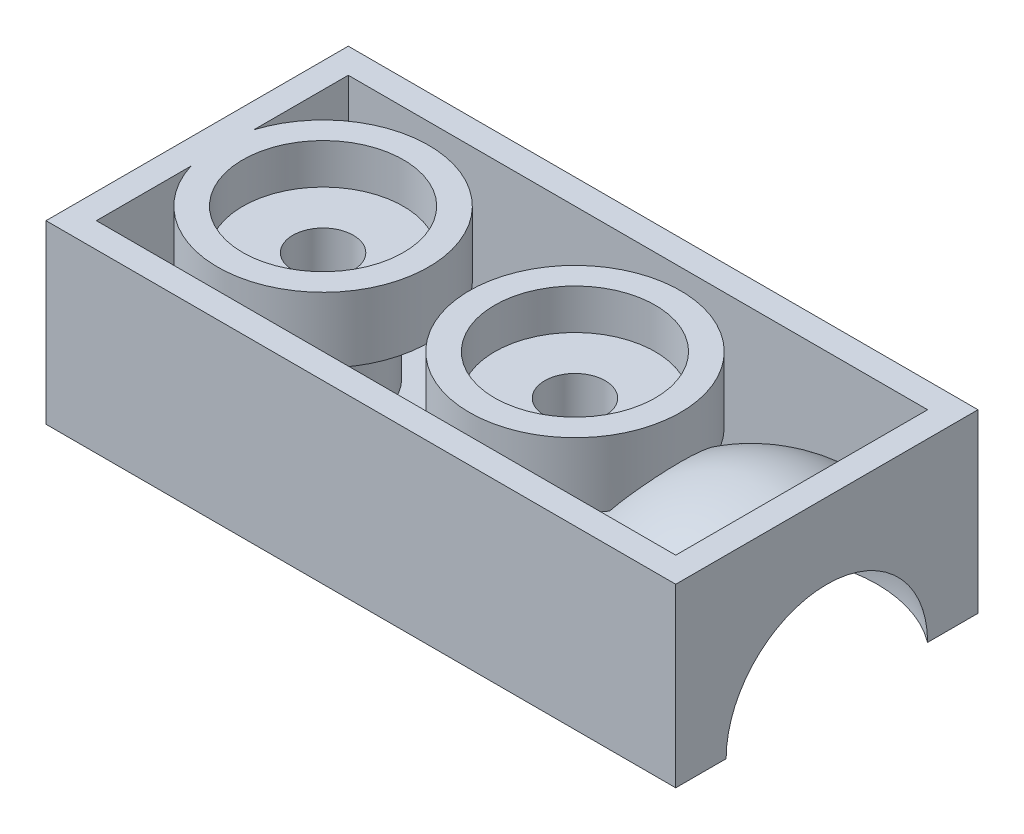
ISO-10303-21;
HEADER;
FILE_DESCRIPTION(('STEP AP214'),'2;1');
FILE_NAME('part.step','',(''),(''),'','','');
FILE_SCHEMA(('AUTOMOTIVE_DESIGN { 1 0 10303 214 1 1 1 1 }'));
ENDSEC;
DATA;
#1=APPLICATION_CONTEXT('core data for automotive mechanical design processes');
#2=APPLICATION_PROTOCOL_DEFINITION('international standard','automotive_design',2000,#1);
#3=PRODUCT_CONTEXT('',#1,'mechanical');
#4=PRODUCT('Part','Part','',(#3));
#5=PRODUCT_RELATED_PRODUCT_CATEGORY('part','',(#4));
#6=PRODUCT_DEFINITION_FORMATION('','',#4);
#7=PRODUCT_DEFINITION_CONTEXT('part definition',#1,'design');
#8=PRODUCT_DEFINITION('design','',#6,#7);
#9=PRODUCT_DEFINITION_SHAPE('','',#8);
#10=(LENGTH_UNIT() NAMED_UNIT(*) SI_UNIT(.MILLI.,.METRE.));
#11=(NAMED_UNIT(*) PLANE_ANGLE_UNIT() SI_UNIT($,.RADIAN.));
#12=(NAMED_UNIT(*) SI_UNIT($,.STERADIAN.) SOLID_ANGLE_UNIT());
#13=UNCERTAINTY_MEASURE_WITH_UNIT(LENGTH_MEASURE(1.E-05),#10,'distance_accuracy_value','');
#14=(GEOMETRIC_REPRESENTATION_CONTEXT(3) GLOBAL_UNCERTAINTY_ASSIGNED_CONTEXT((#13)) GLOBAL_UNIT_ASSIGNED_CONTEXT((#10,
#11,#12)) REPRESENTATION_CONTEXT('',''));
#15=CARTESIAN_POINT('',(0.,0.,0.));
#16=DIRECTION('',(0.,0.,1.));
#17=DIRECTION('',(1.,0.,0.));
#18=AXIS2_PLACEMENT_3D('',#15,#16,#17);
#19=CARTESIAN_POINT('',(0.,7.,0.));
#20=DIRECTION('',(0.,1.,0.));
#21=DIRECTION('',(0.,0.,1.));
#22=AXIS2_PLACEMENT_3D('',#19,#20,#21);
#23=PLANE('',#22);
#24=CARTESIAN_POINT('',(2.5,7.,0.));
#25=DIRECTION('',(0.,1.,0.));
#26=DIRECTION('',(0.,0.,1.));
#27=AXIS2_PLACEMENT_3D('',#24,#25,#26);
#28=CIRCLE('',#27,3.19);
#29=CARTESIAN_POINT('',(2.5,7.,3.19));
#30=VERTEX_POINT('',#29);
#31=EDGE_CURVE('E375',#30,#30,#28,.T.);
#32=ORIENTED_EDGE('',*,*,#31,.F.);
#33=EDGE_LOOP('',(#32));
#34=FACE_BOUND('',#33,.T.);
#35=CARTESIAN_POINT('',(2.5,7.,0.));
#36=DIRECTION('',(0.,1.,0.));
#37=DIRECTION('',(0.,0.,1.));
#38=AXIS2_PLACEMENT_3D('',#35,#36,#37);
#39=CIRCLE('',#38,4.19);
#40=CARTESIAN_POINT('',(2.5,7.,4.19));
#41=VERTEX_POINT('',#40);
#42=EDGE_CURVE('E179',#41,#41,#39,.T.);
#43=ORIENTED_EDGE('',*,*,#42,.T.);
#44=EDGE_LOOP('',(#43));
#45=FACE_BOUND('',#44,.T.);
#46=ADVANCED_FACE('F33',(#34,#45),#23,.T.);
#47=CARTESIAN_POINT('',(2.5,7.,0.));
#48=DIRECTION('',(0.,1.,0.));
#49=DIRECTION('',(0.,0.,1.));
#50=AXIS2_PLACEMENT_3D('',#47,#48,#49);
#51=CYLINDRICAL_SURFACE('',#50,1.2);
#52=CARTESIAN_POINT('',(2.5,5.4,0.));
#53=DIRECTION('',(0.,1.,0.));
#54=DIRECTION('',(0.,0.,1.));
#55=AXIS2_PLACEMENT_3D('',#52,#53,#54);
#56=CIRCLE('',#55,1.2);
#57=CARTESIAN_POINT('',(2.5,5.4,1.2));
#58=VERTEX_POINT('',#57);
#59=EDGE_CURVE('E365',#58,#58,#56,.T.);
#60=ORIENTED_EDGE('',*,*,#59,.T.);
#61=EDGE_LOOP('',(#60));
#62=FACE_BOUND('',#61,.T.);
#63=CARTESIAN_POINT('',(2.5,1.,0.));
#64=DIRECTION('',(0.,-1.,0.));
#65=DIRECTION('',(0.,0.,-1.));
#66=AXIS2_PLACEMENT_3D('',#63,#64,#65);
#67=CIRCLE('',#66,1.2);
#68=CARTESIAN_POINT('',(2.5,1.,-1.2));
#69=VERTEX_POINT('',#68);
#70=EDGE_CURVE('E255',#69,#69,#67,.T.);
#71=ORIENTED_EDGE('',*,*,#70,.T.);
#72=EDGE_LOOP('',(#71));
#73=FACE_BOUND('',#72,.T.);
#74=ADVANCED_FACE('F297',(#62,#73),#51,.F.);
#75=CARTESIAN_POINT('',(-12.5,7.,-6.));
#76=DIRECTION('',(1.,0.,0.));
#77=DIRECTION('',(0.,0.,-1.));
#78=AXIS2_PLACEMENT_3D('',#75,#76,#77);
#79=PLANE('',#78);
#80=DIRECTION('',(0.,0.,1.));
#81=VECTOR('',#80,1.);
#82=CARTESIAN_POINT('',(-12.5,0.,-6.));
#83=LINE('',#82,#81);
#84=CARTESIAN_POINT('',(-12.5,0.,-6.));
#85=VERTEX_POINT('',#84);
#86=CARTESIAN_POINT('',(-12.5,0.,6.));
#87=VERTEX_POINT('',#86);
#88=EDGE_CURVE('E346',#85,#87,#83,.T.);
#89=ORIENTED_EDGE('',*,*,#88,.T.);
#90=DIRECTION('',(0.,-1.,0.));
#91=VECTOR('',#90,1.);
#92=CARTESIAN_POINT('',(-12.5,7.,6.));
#93=LINE('',#92,#91);
#94=CARTESIAN_POINT('',(-12.5,7.,6.));
#95=VERTEX_POINT('',#94);
#96=EDGE_CURVE('E41',#95,#87,#93,.T.);
#97=ORIENTED_EDGE('',*,*,#96,.F.);
#98=DIRECTION('',(0.,0.,1.));
#99=VECTOR('',#98,1.);
#100=CARTESIAN_POINT('',(-12.5,7.,-6.));
#101=LINE('',#100,#99);
#102=CARTESIAN_POINT('',(-12.5,7.,-6.));
#103=VERTEX_POINT('',#102);
#104=EDGE_CURVE('E332',#103,#95,#101,.T.);
#105=ORIENTED_EDGE('',*,*,#104,.F.);
#106=DIRECTION('',(0.,-1.,0.));
#107=VECTOR('',#106,1.);
#108=CARTESIAN_POINT('',(-12.5,7.,-6.));
#109=LINE('',#108,#107);
#110=EDGE_CURVE('E355',#103,#85,#109,.T.);
#111=ORIENTED_EDGE('',*,*,#110,.T.);
#112=EDGE_LOOP('',(#89,#97,#105,#111));
#113=FACE_BOUND('',#112,.T.);
#114=ADVANCED_FACE('F35',(#113),#79,.F.);
#115=CARTESIAN_POINT('',(-12.5,7.,6.));
#116=DIRECTION('',(0.,0.,-1.));
#117=DIRECTION('',(-1.,0.,0.));
#118=AXIS2_PLACEMENT_3D('',#115,#116,#117);
#119=PLANE('',#118);
#120=DIRECTION('',(1.,0.,0.));
#121=VECTOR('',#120,1.);
#122=CARTESIAN_POINT('',(-12.5,0.,6.));
#123=LINE('',#122,#121);
#124=CARTESIAN_POINT('',(12.5,0.,6.));
#125=VERTEX_POINT('',#124);
#126=EDGE_CURVE('E362',#87,#125,#123,.T.);
#127=ORIENTED_EDGE('',*,*,#126,.T.);
#128=DIRECTION('',(0.,-1.,0.));
#129=VECTOR('',#128,1.);
#130=CARTESIAN_POINT('',(12.5,7.,6.));
#131=LINE('',#130,#129);
#132=CARTESIAN_POINT('',(12.5,7.,6.));
#133=VERTEX_POINT('',#132);
#134=EDGE_CURVE('E348',#133,#125,#131,.T.);
#135=ORIENTED_EDGE('',*,*,#134,.F.);
#136=DIRECTION('',(1.,0.,0.));
#137=VECTOR('',#136,1.);
#138=CARTESIAN_POINT('',(-12.5,7.,6.));
#139=LINE('',#138,#137);
#140=EDGE_CURVE('E334',#95,#133,#139,.T.);
#141=ORIENTED_EDGE('',*,*,#140,.F.);
#142=ORIENTED_EDGE('',*,*,#96,.T.);
#143=EDGE_LOOP('',(#127,#135,#141,#142));
#144=FACE_BOUND('',#143,.T.);
#145=ADVANCED_FACE('F624',(#144),#119,.F.);
#146=CARTESIAN_POINT('',(12.5,7.,-6.));
#147=DIRECTION('',(-1.,0.,0.));
#148=DIRECTION('',(0.,0.,1.));
#149=AXIS2_PLACEMENT_3D('',#146,#147,#148);
#150=PLANE('',#149);
#151=CARTESIAN_POINT('',(12.5,0.,0.));
#152=DIRECTION('',(-1.,0.,0.));
#153=DIRECTION('',(0.,0.,1.));
#154=AXIS2_PLACEMENT_3D('',#151,#152,#153);
#155=CIRCLE('',#154,3.99924156033545);
#156=CARTESIAN_POINT('',(12.5,0.,-3.99924156033545));
#157=VERTEX_POINT('',#156);
#158=CARTESIAN_POINT('',(12.5,0.,3.99924156033545));
#159=VERTEX_POINT('',#158);
#160=EDGE_CURVE('E54',#157,#159,#155,.F.);
#161=ORIENTED_EDGE('',*,*,#160,.F.);
#162=DIRECTION('',(0.,0.,-1.));
#163=VECTOR('',#162,1.);
#164=CARTESIAN_POINT('',(12.5,0.,-6.));
#165=LINE('',#164,#163);
#166=CARTESIAN_POINT('',(12.5,0.,-6.));
#167=VERTEX_POINT('',#166);
#168=EDGE_CURVE('E361',#157,#167,#165,.T.);
#169=ORIENTED_EDGE('',*,*,#168,.T.);
#170=DIRECTION('',(0.,-1.,0.));
#171=VECTOR('',#170,1.);
#172=CARTESIAN_POINT('',(12.5,7.,-6.));
#173=LINE('',#172,#171);
#174=CARTESIAN_POINT('',(12.5,7.,-6.));
#175=VERTEX_POINT('',#174);
#176=EDGE_CURVE('E350',#175,#167,#173,.T.);
#177=ORIENTED_EDGE('',*,*,#176,.F.);
#178=DIRECTION('',(0.,0.,-1.));
#179=VECTOR('',#178,1.);
#180=CARTESIAN_POINT('',(12.5,7.,-6.));
#181=LINE('',#180,#179);
#182=EDGE_CURVE('E367',#133,#175,#181,.T.);
#183=ORIENTED_EDGE('',*,*,#182,.F.);
#184=ORIENTED_EDGE('',*,*,#134,.T.);
#185=EDGE_CURVE('E358',#125,#159,#165,.T.);
#186=ORIENTED_EDGE('',*,*,#185,.T.);
#187=EDGE_LOOP('',(#161,#169,#177,#183,#184,#186));
#188=FACE_BOUND('',#187,.T.);
#189=ADVANCED_FACE('F320',(#188),#150,.F.);
#190=CARTESIAN_POINT('',(-12.5,7.,-6.));
#191=DIRECTION('',(0.,0.,1.));
#192=DIRECTION('',(1.,0.,0.));
#193=AXIS2_PLACEMENT_3D('',#190,#191,#192);
#194=PLANE('',#193);
#195=DIRECTION('',(-1.,0.,0.));
#196=VECTOR('',#195,1.);
#197=CARTESIAN_POINT('',(-12.5,0.,-6.));
#198=LINE('',#197,#196);
#199=EDGE_CURVE('E341',#167,#85,#198,.T.);
#200=ORIENTED_EDGE('',*,*,#199,.T.);
#201=ORIENTED_EDGE('',*,*,#110,.F.);
#202=DIRECTION('',(-1.,0.,0.));
#203=VECTOR('',#202,1.);
#204=CARTESIAN_POINT('',(-12.5,7.,-6.));
#205=LINE('',#204,#203);
#206=EDGE_CURVE('E337',#175,#103,#205,.T.);
#207=ORIENTED_EDGE('',*,*,#206,.F.);
#208=ORIENTED_EDGE('',*,*,#176,.T.);
#209=EDGE_LOOP('',(#200,#201,#207,#208));
#210=FACE_BOUND('',#209,.T.);
#211=ADVANCED_FACE('F312',(#210),#194,.F.);
#212=DIRECTION('',(0.,0.,1.));
#213=VECTOR('',#212,1.);
#214=CARTESIAN_POINT('',(-11.5,7.,-6.));
#215=LINE('',#214,#213);
#216=CARTESIAN_POINT('',(-11.5,7.,-5.));
#217=VERTEX_POINT('',#216);
#218=CARTESIAN_POINT('',(-11.5,7.,-1.2474373731775));
#219=VERTEX_POINT('',#218);
#220=EDGE_CURVE('E200',#217,#219,#215,.T.);
#221=ORIENTED_EDGE('',*,*,#220,.F.);
#222=DIRECTION('',(-1.,0.,0.));
#223=VECTOR('',#222,1.);
#224=CARTESIAN_POINT('',(-12.5,7.,-5.));
#225=LINE('',#224,#223);
#226=CARTESIAN_POINT('',(11.5,7.,-5.));
#227=VERTEX_POINT('',#226);
#228=EDGE_CURVE('E185',#227,#217,#225,.T.);
#229=ORIENTED_EDGE('',*,*,#228,.F.);
#230=DIRECTION('',(0.,0.,-1.));
#231=VECTOR('',#230,1.);
#232=CARTESIAN_POINT('',(11.5,7.,-6.));
#233=LINE('',#232,#231);
#234=CARTESIAN_POINT('',(11.5,7.,5.));
#235=VERTEX_POINT('',#234);
#236=EDGE_CURVE('E48',#235,#227,#233,.T.);
#237=ORIENTED_EDGE('',*,*,#236,.F.);
#238=DIRECTION('',(1.,0.,0.));
#239=VECTOR('',#238,1.);
#240=CARTESIAN_POINT('',(-12.5,7.,5.));
#241=LINE('',#240,#239);
#242=CARTESIAN_POINT('',(-11.5,7.,5.));
#243=VERTEX_POINT('',#242);
#244=EDGE_CURVE('E203',#243,#235,#241,.T.);
#245=ORIENTED_EDGE('',*,*,#244,.F.);
#246=CARTESIAN_POINT('',(-11.5,7.,1.24743737317751));
#247=VERTEX_POINT('',#246);
#248=EDGE_CURVE('E160',#247,#243,#215,.T.);
#249=ORIENTED_EDGE('',*,*,#248,.F.);
#250=CARTESIAN_POINT('',(-7.5,7.,0.));
#251=DIRECTION('',(0.,1.,0.));
#252=DIRECTION('',(0.,0.,1.));
#253=AXIS2_PLACEMENT_3D('',#250,#251,#252);
#254=CIRCLE('',#253,4.19);
#255=EDGE_CURVE('E190',#247,#219,#254,.T.);
#256=ORIENTED_EDGE('',*,*,#255,.T.);
#257=EDGE_LOOP('',(#221,#229,#237,#245,#249,#256));
#258=FACE_BOUND('',#257,.T.);
#259=CARTESIAN_POINT('',(-7.5,7.,0.));
#260=DIRECTION('',(0.,1.,0.));
#261=DIRECTION('',(0.,0.,1.));
#262=AXIS2_PLACEMENT_3D('',#259,#260,#261);
#263=CIRCLE('',#262,3.19);
#264=CARTESIAN_POINT('',(-7.5,7.,3.19));
#265=VERTEX_POINT('',#264);
#266=EDGE_CURVE('E329',#265,#265,#263,.T.);
#267=ORIENTED_EDGE('',*,*,#266,.F.);
#268=EDGE_LOOP('',(#267));
#269=FACE_BOUND('',#268,.T.);
#270=ORIENTED_EDGE('',*,*,#104,.T.);
#271=ORIENTED_EDGE('',*,*,#140,.T.);
#272=ORIENTED_EDGE('',*,*,#182,.T.);
#273=ORIENTED_EDGE('',*,*,#206,.T.);
#274=EDGE_LOOP('',(#270,#271,#272,#273));
#275=FACE_BOUND('',#274,.T.);
#276=ADVANCED_FACE('F300',(#258,#269,#275),#23,.T.);
#277=CARTESIAN_POINT('',(0.,0.,0.));
#278=DIRECTION('',(0.,1.,0.));
#279=DIRECTION('',(0.,0.,1.));
#280=AXIS2_PLACEMENT_3D('',#277,#278,#279);
#281=PLANE('',#280);
#282=CARTESIAN_POINT('',(2.5,0.,0.));
#283=DIRECTION('',(0.,-1.,0.));
#284=DIRECTION('',(0.,0.,-1.));
#285=AXIS2_PLACEMENT_3D('',#282,#283,#284);
#286=CIRCLE('',#285,1.7);
#287=CARTESIAN_POINT('',(2.5,0.,-1.7));
#288=VERTEX_POINT('',#287);
#289=EDGE_CURVE('E390',#288,#288,#286,.T.);
#290=ORIENTED_EDGE('',*,*,#289,.F.);
#291=EDGE_LOOP('',(#290));
#292=FACE_BOUND('',#291,.T.);
#293=CARTESIAN_POINT('',(9.5,0.,0.));
#294=DIRECTION('',(0.,1.,0.));
#295=DIRECTION('',(0.,0.,1.));
#296=AXIS2_PLACEMENT_3D('',#293,#294,#295);
#297=CIRCLE('',#296,4.99939326897918);
#298=EDGE_CURVE('E11',#159,#157,#297,.F.);
#299=ORIENTED_EDGE('',*,*,#298,.F.);
#300=ORIENTED_EDGE('',*,*,#185,.F.);
#301=ORIENTED_EDGE('',*,*,#126,.F.);
#302=ORIENTED_EDGE('',*,*,#88,.F.);
#303=ORIENTED_EDGE('',*,*,#199,.F.);
#304=ORIENTED_EDGE('',*,*,#168,.F.);
#305=EDGE_LOOP('',(#299,#300,#301,#302,#303,#304));
#306=FACE_BOUND('',#305,.T.);
#307=CARTESIAN_POINT('',(-7.5,0.,0.));
#308=DIRECTION('',(0.,1.,0.));
#309=DIRECTION('',(0.,0.,1.));
#310=AXIS2_PLACEMENT_3D('',#307,#308,#309);
#311=CIRCLE('',#310,1.2);
#312=CARTESIAN_POINT('',(-7.5,0.,1.2));
#313=VERTEX_POINT('',#312);
#314=EDGE_CURVE('E378',#313,#313,#311,.T.);
#315=ORIENTED_EDGE('',*,*,#314,.T.);
#316=EDGE_LOOP('',(#315));
#317=FACE_BOUND('',#316,.T.);
#318=ADVANCED_FACE('F311',(#292,#306,#317),#281,.F.);
#319=CARTESIAN_POINT('',(3.7,5.4,0.));
#320=DIRECTION('',(0.,-1.,0.));
#321=DIRECTION('',(0.,0.,-1.));
#322=AXIS2_PLACEMENT_3D('',#319,#320,#321);
#323=PLANE('',#322);
#324=ORIENTED_EDGE('',*,*,#59,.F.);
#325=EDGE_LOOP('',(#324));
#326=FACE_BOUND('',#325,.T.);
#327=CARTESIAN_POINT('',(2.5,5.4,0.));
#328=DIRECTION('',(0.,1.,0.));
#329=DIRECTION('',(0.,0.,1.));
#330=AXIS2_PLACEMENT_3D('',#327,#328,#329);
#331=CIRCLE('',#330,3.19);
#332=CARTESIAN_POINT('',(2.5,5.4,3.19));
#333=VERTEX_POINT('',#332);
#334=EDGE_CURVE('E372',#333,#333,#331,.T.);
#335=ORIENTED_EDGE('',*,*,#334,.T.);
#336=EDGE_LOOP('',(#335));
#337=FACE_BOUND('',#336,.T.);
#338=ADVANCED_FACE('F317',(#326,#337),#323,.F.);
#339=CARTESIAN_POINT('',(2.5,7.,0.));
#340=DIRECTION('',(0.,1.,0.));
#341=DIRECTION('',(0.,0.,1.));
#342=AXIS2_PLACEMENT_3D('',#339,#340,#341);
#343=CYLINDRICAL_SURFACE('',#342,3.19);
#344=ORIENTED_EDGE('',*,*,#334,.F.);
#345=EDGE_LOOP('',(#344));
#346=FACE_BOUND('',#345,.T.);
#347=ORIENTED_EDGE('',*,*,#31,.T.);
#348=EDGE_LOOP('',(#347));
#349=FACE_BOUND('',#348,.T.);
#350=ADVANCED_FACE('F412',(#346,#349),#343,.F.);
#351=CARTESIAN_POINT('',(-7.5,7.,0.));
#352=DIRECTION('',(0.,1.,0.));
#353=DIRECTION('',(0.,0.,1.));
#354=AXIS2_PLACEMENT_3D('',#351,#352,#353);
#355=CYLINDRICAL_SURFACE('',#354,1.2);
#356=ORIENTED_EDGE('',*,*,#314,.F.);
#357=EDGE_LOOP('',(#356));
#358=FACE_BOUND('',#357,.T.);
#359=CARTESIAN_POINT('',(-7.5,5.4,0.));
#360=DIRECTION('',(0.,1.,0.));
#361=DIRECTION('',(0.,0.,1.));
#362=AXIS2_PLACEMENT_3D('',#359,#360,#361);
#363=CIRCLE('',#362,1.2);
#364=CARTESIAN_POINT('',(-7.5,5.4,1.2));
#365=VERTEX_POINT('',#364);
#366=EDGE_CURVE('E381',#365,#365,#363,.T.);
#367=ORIENTED_EDGE('',*,*,#366,.T.);
#368=EDGE_LOOP('',(#367));
#369=FACE_BOUND('',#368,.T.);
#370=ADVANCED_FACE('F408',(#358,#369),#355,.F.);
#371=CARTESIAN_POINT('',(-6.3,5.4,0.));
#372=DIRECTION('',(0.,-1.,0.));
#373=DIRECTION('',(0.,0.,-1.));
#374=AXIS2_PLACEMENT_3D('',#371,#372,#373);
#375=PLANE('',#374);
#376=ORIENTED_EDGE('',*,*,#366,.F.);
#377=EDGE_LOOP('',(#376));
#378=FACE_BOUND('',#377,.T.);
#379=CARTESIAN_POINT('',(-7.5,5.4,0.));
#380=DIRECTION('',(0.,1.,0.));
#381=DIRECTION('',(0.,0.,1.));
#382=AXIS2_PLACEMENT_3D('',#379,#380,#381);
#383=CIRCLE('',#382,3.19);
#384=CARTESIAN_POINT('',(-7.5,5.4,3.19));
#385=VERTEX_POINT('',#384);
#386=EDGE_CURVE('E384',#385,#385,#383,.T.);
#387=ORIENTED_EDGE('',*,*,#386,.T.);
#388=EDGE_LOOP('',(#387));
#389=FACE_BOUND('',#388,.T.);
#390=ADVANCED_FACE('F411',(#378,#389),#375,.F.);
#391=CARTESIAN_POINT('',(-7.5,7.,0.));
#392=DIRECTION('',(0.,1.,0.));
#393=DIRECTION('',(0.,0.,1.));
#394=AXIS2_PLACEMENT_3D('',#391,#392,#393);
#395=CYLINDRICAL_SURFACE('',#394,3.19);
#396=ORIENTED_EDGE('',*,*,#386,.F.);
#397=EDGE_LOOP('',(#396));
#398=FACE_BOUND('',#397,.T.);
#399=ORIENTED_EDGE('',*,*,#266,.T.);
#400=EDGE_LOOP('',(#399));
#401=FACE_BOUND('',#400,.T.);
#402=ADVANCED_FACE('F418',(#398,#401),#395,.F.);
#403=CARTESIAN_POINT('',(9.5,0.,0.));
#404=DIRECTION('',(-1.,0.,0.));
#405=DIRECTION('',(0.,0.,1.));
#406=AXIS2_PLACEMENT_3D('',#403,#404,#405);
#407=SPHERICAL_SURFACE('',#406,4.99939326897918);
#408=ORIENTED_EDGE('',*,*,#160,.T.);
#409=ORIENTED_EDGE('',*,*,#298,.T.);
#410=EDGE_LOOP('',(#408,#409));
#411=FACE_BOUND('',#410,.T.);
#412=ADVANCED_FACE('F399',(#411),#407,.F.);
#413=CARTESIAN_POINT('',(2.5,1.,0.));
#414=DIRECTION('',(0.,-1.,0.));
#415=DIRECTION('',(0.,0.,-1.));
#416=AXIS2_PLACEMENT_3D('',#413,#414,#415);
#417=CYLINDRICAL_SURFACE('',#416,1.7);
#418=CARTESIAN_POINT('',(2.5,1.,0.));
#419=DIRECTION('',(0.,-1.,0.));
#420=DIRECTION('',(0.,0.,-1.));
#421=AXIS2_PLACEMENT_3D('',#418,#419,#420);
#422=CIRCLE('',#421,1.7);
#423=CARTESIAN_POINT('',(2.5,1.,-1.7));
#424=VERTEX_POINT('',#423);
#425=EDGE_CURVE('E389',#424,#424,#422,.T.);
#426=ORIENTED_EDGE('',*,*,#425,.F.);
#427=EDGE_LOOP('',(#426));
#428=FACE_BOUND('',#427,.T.);
#429=ORIENTED_EDGE('',*,*,#289,.T.);
#430=EDGE_LOOP('',(#429));
#431=FACE_BOUND('',#430,.T.);
#432=ADVANCED_FACE('F396',(#428,#431),#417,.F.);
#433=CARTESIAN_POINT('',(2.5,1.,0.));
#434=DIRECTION('',(0.,-1.,0.));
#435=DIRECTION('',(0.,0.,-1.));
#436=AXIS2_PLACEMENT_3D('',#433,#434,#435);
#437=PLANE('',#436);
#438=ORIENTED_EDGE('',*,*,#70,.F.);
#439=EDGE_LOOP('',(#438));
#440=FACE_BOUND('',#439,.T.);
#441=ORIENTED_EDGE('',*,*,#425,.T.);
#442=EDGE_LOOP('',(#441));
#443=FACE_BOUND('',#442,.T.);
#444=ADVANCED_FACE('F239',(#440,#443),#437,.T.);
#445=CARTESIAN_POINT('',(9.5,0.,0.));
#446=DIRECTION('',(-1.,0.,0.));
#447=DIRECTION('',(0.,0.,1.));
#448=AXIS2_PLACEMENT_3D('',#445,#446,#447);
#449=SPHERICAL_SURFACE('',#448,5.99939326897918);
#450=CARTESIAN_POINT('',(4.06046288886624,1.9998,-1.55079191785076));
#451=CARTESIAN_POINT('',(4.08486704752561,2.08527992125767,-1.52618286150711));
#452=CARTESIAN_POINT('',(4.11058560651266,2.16976699431283,-1.49919084443797));
#453=CARTESIAN_POINT('',(4.16422602348194,2.33640695253375,-1.43944986467757));
#454=CARTESIAN_POINT('',(4.19215706400886,2.41854795348415,-1.40667613324098));
#455=CARTESIAN_POINT('',(4.24997008115709,2.58049595495287,-1.3340830414878));
#456=CARTESIAN_POINT('',(4.27987369896867,2.66025495708171,-1.29417249786431));
#457=CARTESIAN_POINT('',(4.34037443734802,2.81494606824351,-1.2065880704233));
#458=CARTESIAN_POINT('',(4.37097003465554,2.88988760417632,-1.15893003496537));
#459=CARTESIAN_POINT('',(4.4285096193332,3.02588499523952,-1.06007773579007));
#460=CARTESIAN_POINT('',(4.45549819528828,3.08757158936438,-1.00978756963519));
#461=CARTESIAN_POINT('',(4.50786343554497,3.20408988210664,-0.90117151022431));
#462=CARTESIAN_POINT('',(4.53324297087088,3.25893396945931,-0.84286055383544));
#463=CARTESIAN_POINT('',(4.5811230184588,3.36021450789517,-0.716624448231265));
#464=CARTESIAN_POINT('',(4.60357717490812,3.40651952599866,-0.648573749056265));
#465=CARTESIAN_POINT('',(4.6428327479347,3.4862561217106,-0.50381640493437));
#466=CARTESIAN_POINT('',(4.65964999114076,3.5197237813192,-0.427134816391818));
#467=CARTESIAN_POINT('',(4.68119602206881,3.56226951561216,-0.292371516785891));
#468=CARTESIAN_POINT('',(4.6880619236755,3.57570493266052,-0.235999383783905));
#469=CARTESIAN_POINT('',(4.69738978501317,3.59392031888985,-0.121510511166));
#470=CARTESIAN_POINT('',(4.69985451365654,3.59870573007708,-0.063394891850758));
#471=CARTESIAN_POINT('',(4.70013310911473,3.59924757769822,0.0529580161669753));
#472=CARTESIAN_POINT('',(4.6979413295443,3.59499305249211,0.111195366939667));
#473=CARTESIAN_POINT('',(4.68911783986064,3.57777037066788,0.226016506555757));
#474=CARTESIAN_POINT('',(4.68248431392212,3.56479865037531,0.282599609250536));
#475=CARTESIAN_POINT('',(4.66539664760661,3.53108362917728,0.392627120228014));
#476=CARTESIAN_POINT('',(4.65494980889993,3.51035517883813,0.446077301870235));
#477=CARTESIAN_POINT('',(4.63101703677018,3.46230213833661,0.549155435583377));
#478=CARTESIAN_POINT('',(4.61752999822307,3.43497514932287,0.598781988927069));
#479=CARTESIAN_POINT('',(4.5795876215529,3.35696702442237,0.722234733794524));
#480=CARTESIAN_POINT('',(4.55338527120332,3.30207250569291,0.792860674956289));
#481=CARTESIAN_POINT('',(4.49792622420162,3.18233959698182,0.923785863553283));
#482=CARTESIAN_POINT('',(4.46866061023746,3.11747190231003,0.984053532029165));
#483=CARTESIAN_POINT('',(4.41494656453476,2.99416086392196,1.08421972704942));
#484=CARTESIAN_POINT('',(4.39068457255228,2.93696839138446,1.12579221977245));
#485=CARTESIAN_POINT('',(4.34217409168003,2.81897818447166,1.20353519311868));
#486=CARTESIAN_POINT('',(4.31792562402564,2.75817796225715,1.23970188407439));
#487=CARTESIAN_POINT('',(4.26998605293329,2.63370532153085,1.30723545275072));
#488=CARTESIAN_POINT('',(4.24629546503035,2.57003039366472,1.33859802777337));
#489=CARTESIAN_POINT('',(4.19990043845127,2.44039510553804,1.39704335859487));
#490=CARTESIAN_POINT('',(4.17719616936457,2.37443435572674,1.42412538048319));
#491=CARTESIAN_POINT('',(4.1385173468415,2.25710172891227,1.4682977357429));
#492=CARTESIAN_POINT('',(4.12225998050423,2.20612754135045,1.48620808441879));
#493=CARTESIAN_POINT('',(4.09066756782094,2.10349538155221,1.51996832849914));
#494=CARTESIAN_POINT('',(4.07532869137901,2.05184153164018,1.53582715496501));
#495=CARTESIAN_POINT('',(4.06046288886624,1.9998,1.55079191785076));
#496=B_SPLINE_CURVE_WITH_KNOTS('',3,(#450,#451,#452,#453,#454,#455,#456,#457,#458,#459,#460,
#461,#462,#463,#464,#465,#466,#467,#468,#469,#470,#471,#472,#473,#474,#475,#476,#477,#478,#479,
#480,#481,#482,#483,#484,#485,#486,#487,#488,#489,#490,#491,#492,#493,#494,#495),.UNSPECIFIED.,
.F.,.F.,(4,2,2,2,2,2,2,2,2,2,2,2,2,2,2,2,2,2,2,2,2,2,4),(0.,0.276766951144772,0.554749708783703,
0.836577459489084,1.11783579148102,1.36940937702099,1.62052065268596,1.87522253550123,
2.12920318754541,2.30352472831733,2.47773655939071,2.65215975667557,2.82665430327918,
3.00081646832547,3.17504204435525,3.45308158087987,3.73195428538805,3.9559033829968,
4.18000874821567,4.40431366933121,4.62865700641369,4.79787635848358,4.96633228928886),.UNSPECIFIED.);
#497=CARTESIAN_POINT('',(4.06052002886624,2.,-1.55073441939854));
#498=VERTEX_POINT('',#497);
#499=CARTESIAN_POINT('',(4.06052002886624,2.,1.55073441939854));
#500=VERTEX_POINT('',#499);
#501=EDGE_CURVE('E246',#498,#500,#496,.T.);
#502=ORIENTED_EDGE('',*,*,#501,.T.);
#503=CARTESIAN_POINT('',(9.5,2.,0.));
#504=DIRECTION('',(0.,-1.,0.));
#505=DIRECTION('',(0.,0.,-1.));
#506=AXIS2_PLACEMENT_3D('',#503,#504,#505);
#507=CIRCLE('',#506,5.65621070999593);
#508=CARTESIAN_POINT('',(4.23552002886624,2.,2.06832546505721));
#509=VERTEX_POINT('',#508);
#510=EDGE_CURVE('E256',#509,#500,#507,.T.);
#511=ORIENTED_EDGE('',*,*,#510,.F.);
#512=CARTESIAN_POINT('',(4.47497414034014,2.71152310715483,1.8410532705459));
#513=CARTESIAN_POINT('',(4.44901926572324,2.64452987344144,1.8688829942012));
#514=CARTESIAN_POINT('',(4.42366302062436,2.57657732099036,1.89491691659727));
#515=CARTESIAN_POINT('',(4.37438338216154,2.43901613199998,1.94368224380597));
#516=CARTESIAN_POINT('',(4.35045948513637,2.36940808975938,1.96641481354043));
#517=CARTESIAN_POINT('',(4.30429752805705,2.22886057932212,2.00885262228461));
#518=CARTESIAN_POINT('',(4.28205689349148,2.15792336026549,2.02856253379556));
#519=CARTESIAN_POINT('',(4.23939978910653,2.01480542298796,2.06525510166191));
#520=CARTESIAN_POINT('',(4.21898348989564,1.94262458921784,2.08223750306374));
#521=CARTESIAN_POINT('',(4.16173027930048,1.72828607129275,2.12862346561401));
#522=CARTESIAN_POINT('',(4.12765999144083,1.58461499620236,2.15455330788238));
#523=CARTESIAN_POINT('',(4.06795576807621,1.29429446216962,2.19838132430869));
#524=CARTESIAN_POINT('',(4.04232567069089,1.14764368031983,2.21627584579983));
#525=CARTESIAN_POINT('',(3.99830909932939,0.839518941594369,2.24629582686769));
#526=CARTESIAN_POINT('',(3.98074621068464,0.677864816569432,2.25778439294665));
#527=CARTESIAN_POINT('',(3.956845597369,0.353371824681873,2.27328108537404));
#528=CARTESIAN_POINT('',(3.95050711215463,0.190533038840332,2.27728971854899));
#529=CARTESIAN_POINT('',(3.94952781747698,-0.0560966504771442,2.27790684763668));
#530=CARTESIAN_POINT('',(3.95070252841715,-0.139892454723802,2.2771627937869));
#531=CARTESIAN_POINT('',(3.95605288005086,-0.307354481891732,2.27374623577534));
#532=CARTESIAN_POINT('',(3.96022852749636,-0.39102070452103,2.27107372727463));
#533=CARTESIAN_POINT('',(3.97155366412602,-0.558073468087244,2.26375297077995));
#534=CARTESIAN_POINT('',(3.97870348798736,-0.641459976483714,2.25910450043426));
#535=CARTESIAN_POINT('',(3.99591967647118,-0.80779051935575,2.24773663601553));
#536=CARTESIAN_POINT('',(4.00598608041218,-0.890734547850875,2.24101721402382));
#537=CARTESIAN_POINT('',(4.01748201034001,-0.973379546031659,2.23321480119903));
#538=B_SPLINE_CURVE_WITH_KNOTS('',3,(#512,#513,#514,#515,#516,#517,#518,#519,#520,#521,#522,
#523,#524,#525,#526,#527,#528,#529,#530,#531,#532,#533,#534,#535,#536,#537),.UNSPECIFIED.,.F.,
.F.,(4,2,2,2,2,2,2,2,2,2,2,2,4),(0.,0.231088214591502,0.462094687771623,0.692740385526469,
0.923407630317793,1.37259368803446,1.82198372891299,2.31044750359614,2.79887817966936,
3.05023708689246,3.30159655966177,3.55298432498581,3.80437547943565),.UNSPECIFIED.);
#539=CARTESIAN_POINT('',(4.02123431458052,1.,2.23066047621388));
#540=VERTEX_POINT('',#539);
#541=EDGE_CURVE('E225',#509,#540,#538,.T.);
#542=ORIENTED_EDGE('',*,*,#541,.T.);
#543=CARTESIAN_POINT('',(9.5,1.,0.));
#544=DIRECTION('',(0.,1.,0.));
#545=DIRECTION('',(0.,0.,1.));
#546=AXIS2_PLACEMENT_3D('',#543,#544,#545);
#547=CIRCLE('',#546,5.91546444464614);
#548=CARTESIAN_POINT('',(6.3388736823922,1.,5.));
#549=VERTEX_POINT('',#548);
#550=EDGE_CURVE('E161',#549,#540,#547,.F.);
#551=ORIENTED_EDGE('',*,*,#550,.F.);
#552=CARTESIAN_POINT('',(9.5,0.,5.));
#553=DIRECTION('',(0.,0.,-1.));
#554=DIRECTION('',(-1.,0.,0.));
#555=AXIS2_PLACEMENT_3D('',#552,#553,#554);
#556=CIRCLE('',#555,3.31552704646979);
#557=CARTESIAN_POINT('',(11.5,2.64437508607849,5.));
#558=VERTEX_POINT('',#557);
#559=EDGE_CURVE('E147',#549,#558,#556,.T.);
#560=ORIENTED_EDGE('',*,*,#559,.T.);
#561=CARTESIAN_POINT('',(11.5,0.,0.));
#562=DIRECTION('',(-1.,0.,0.));
#563=DIRECTION('',(0.,0.,1.));
#564=AXIS2_PLACEMENT_3D('',#561,#562,#563);
#565=CIRCLE('',#564,5.65621070999593);
#566=CARTESIAN_POINT('',(11.5,2.6443750860785,-5.));
#567=VERTEX_POINT('',#566);
#568=EDGE_CURVE('E187',#567,#558,#565,.F.);
#569=ORIENTED_EDGE('',*,*,#568,.F.);
#570=CARTESIAN_POINT('',(9.5,0.,-5.));
#571=DIRECTION('',(0.,0.,1.));
#572=DIRECTION('',(1.,0.,0.));
#573=AXIS2_PLACEMENT_3D('',#570,#571,#572);
#574=CIRCLE('',#573,3.31552704646979);
#575=CARTESIAN_POINT('',(6.33887368239219,1.,-5.));
#576=VERTEX_POINT('',#575);
#577=EDGE_CURVE('E214',#576,#567,#574,.F.);
#578=ORIENTED_EDGE('',*,*,#577,.F.);
#579=CARTESIAN_POINT('',(4.02123431458052,1.,-2.23066047621388));
#580=VERTEX_POINT('',#579);
#581=EDGE_CURVE('E212',#580,#576,#547,.F.);
#582=ORIENTED_EDGE('',*,*,#581,.F.);
#583=CARTESIAN_POINT('',(4.47497414034014,2.71152310715483,-1.8410532705459));
#584=CARTESIAN_POINT('',(4.44901926572324,2.64452987344144,-1.8688829942012));
#585=CARTESIAN_POINT('',(4.42366302062436,2.57657732099036,-1.89491691659727));
#586=CARTESIAN_POINT('',(4.37438338216154,2.43901613199998,-1.94368224380597));
#587=CARTESIAN_POINT('',(4.35045948513637,2.36940808975938,-1.96641481354043));
#588=CARTESIAN_POINT('',(4.30429752805705,2.22886057932212,-2.00885262228461));
#589=CARTESIAN_POINT('',(4.28205689349148,2.15792336026549,-2.02856253379556));
#590=CARTESIAN_POINT('',(4.23939978910653,2.01480542298796,-2.06525510166191));
#591=CARTESIAN_POINT('',(4.21898348989564,1.94262458921784,-2.08223750306374));
#592=CARTESIAN_POINT('',(4.16173027930048,1.72828607129275,-2.12862346561401));
#593=CARTESIAN_POINT('',(4.12765999144083,1.58461499620236,-2.15455330788238));
#594=CARTESIAN_POINT('',(4.06795576807621,1.29429446216962,-2.19838132430869));
#595=CARTESIAN_POINT('',(4.04232567069089,1.14764368031983,-2.21627584579983));
#596=CARTESIAN_POINT('',(3.99830909932939,0.839518941594369,-2.24629582686769));
#597=CARTESIAN_POINT('',(3.98074621068464,0.677864816569432,-2.25778439294665));
#598=CARTESIAN_POINT('',(3.956845597369,0.353371824681873,-2.27328108537404));
#599=CARTESIAN_POINT('',(3.95050711215463,0.190533038840332,-2.27728971854899));
#600=CARTESIAN_POINT('',(3.94952781747698,-0.0560966504771442,-2.27790684763668));
#601=CARTESIAN_POINT('',(3.95070252841715,-0.139892454723802,-2.2771627937869));
#602=CARTESIAN_POINT('',(3.95605288005086,-0.307354481891732,-2.27374623577534));
#603=CARTESIAN_POINT('',(3.96022852749636,-0.39102070452103,-2.27107372727463));
#604=CARTESIAN_POINT('',(3.97155366412602,-0.558073468087244,-2.26375297077995));
#605=CARTESIAN_POINT('',(3.97870348798736,-0.641459976483714,-2.25910450043426));
#606=CARTESIAN_POINT('',(3.99591967647118,-0.80779051935575,-2.24773663601553));
#607=CARTESIAN_POINT('',(4.00598608041218,-0.890734547850875,-2.24101721402382));
#608=CARTESIAN_POINT('',(4.01748201034001,-0.973379546031659,-2.23321480119903));
#609=B_SPLINE_CURVE_WITH_KNOTS('',3,(#583,#584,#585,#586,#587,#588,#589,#590,#591,#592,#593,
#594,#595,#596,#597,#598,#599,#600,#601,#602,#603,#604,#605,#606,#607,#608),.UNSPECIFIED.,.F.,
.F.,(4,2,2,2,2,2,2,2,2,2,2,2,4),(0.,0.231088214591502,0.462094687771623,0.692740385526469,
0.923407630317793,1.37259368803446,1.82198372891299,2.31044750359614,2.79887817966936,
3.05023708689246,3.30159655966177,3.55298432498581,3.80437547943565),.UNSPECIFIED.);
#610=CARTESIAN_POINT('',(4.23552002886624,2.,-2.06832546505721));
#611=VERTEX_POINT('',#610);
#612=EDGE_CURVE('E217',#611,#580,#609,.T.);
#613=ORIENTED_EDGE('',*,*,#612,.F.);
#614=EDGE_CURVE('E257',#498,#611,#507,.T.);
#615=ORIENTED_EDGE('',*,*,#614,.F.);
#616=EDGE_LOOP('',(#502,#511,#542,#551,#560,#569,#578,#582,#613,#615));
#617=FACE_BOUND('',#616,.T.);
#618=ADVANCED_FACE('F234',(#617),#449,.T.);
#619=CARTESIAN_POINT('',(2.5,7.,0.));
#620=DIRECTION('',(0.,1.,0.));
#621=DIRECTION('',(0.,0.,1.));
#622=AXIS2_PLACEMENT_3D('',#619,#620,#621);
#623=CYLINDRICAL_SURFACE('',#622,2.2);
#624=CARTESIAN_POINT('',(2.5,4.4,0.));
#625=DIRECTION('',(0.,-1.,0.));
#626=DIRECTION('',(0.,0.,-1.));
#627=AXIS2_PLACEMENT_3D('',#624,#625,#626);
#628=CIRCLE('',#627,2.2);
#629=CARTESIAN_POINT('',(2.5,4.4,-2.2));
#630=VERTEX_POINT('',#629);
#631=EDGE_CURVE('E169',#630,#630,#628,.F.);
#632=ORIENTED_EDGE('',*,*,#631,.F.);
#633=EDGE_LOOP('',(#632));
#634=FACE_BOUND('',#633,.T.);
#635=CARTESIAN_POINT('',(2.5,2.,0.));
#636=DIRECTION('',(0.,-1.,0.));
#637=DIRECTION('',(0.,0.,-1.));
#638=AXIS2_PLACEMENT_3D('',#635,#636,#637);
#639=CIRCLE('',#638,2.2);
#640=EDGE_CURVE('E460',#500,#498,#639,.T.);
#641=ORIENTED_EDGE('',*,*,#640,.F.);
#642=ORIENTED_EDGE('',*,*,#501,.F.);
#643=EDGE_LOOP('',(#641,#642));
#644=FACE_BOUND('',#643,.T.);
#645=ADVANCED_FACE('F238',(#634,#644),#623,.T.);
#646=CARTESIAN_POINT('',(-11.5,7.,-6.));
#647=DIRECTION('',(1.,0.,0.));
#648=DIRECTION('',(0.,0.,-1.));
#649=AXIS2_PLACEMENT_3D('',#646,#647,#648);
#650=PLANE('',#649);
#651=DIRECTION('',(0.,1.,0.));
#652=VECTOR('',#651,1.);
#653=CARTESIAN_POINT('',(-11.5,7.,1.2474373731775));
#654=LINE('',#653,#652);
#655=CARTESIAN_POINT('',(-11.5,4.4,1.2474373731775));
#656=VERTEX_POINT('',#655);
#657=EDGE_CURVE('E209',#247,#656,#654,.F.);
#658=ORIENTED_EDGE('',*,*,#657,.F.);
#659=ORIENTED_EDGE('',*,*,#248,.T.);
#660=DIRECTION('',(0.,-1.,0.));
#661=VECTOR('',#660,1.);
#662=CARTESIAN_POINT('',(-11.5,7.,5.));
#663=LINE('',#662,#661);
#664=CARTESIAN_POINT('',(-11.5,1.,5.));
#665=VERTEX_POINT('',#664);
#666=EDGE_CURVE('E144',#243,#665,#663,.T.);
#667=ORIENTED_EDGE('',*,*,#666,.T.);
#668=DIRECTION('',(0.,0.,1.));
#669=VECTOR('',#668,1.);
#670=CARTESIAN_POINT('',(-11.5,1.,-6.));
#671=LINE('',#670,#669);
#672=CARTESIAN_POINT('',(-11.5,1.,-5.));
#673=VERTEX_POINT('',#672);
#674=EDGE_CURVE('E153',#673,#665,#671,.T.);
#675=ORIENTED_EDGE('',*,*,#674,.F.);
#676=DIRECTION('',(0.,-1.,0.));
#677=VECTOR('',#676,1.);
#678=CARTESIAN_POINT('',(-11.5,7.,-5.));
#679=LINE('',#678,#677);
#680=EDGE_CURVE('E182',#217,#673,#679,.T.);
#681=ORIENTED_EDGE('',*,*,#680,.F.);
#682=ORIENTED_EDGE('',*,*,#220,.T.);
#683=DIRECTION('',(0.,1.,0.));
#684=VECTOR('',#683,1.);
#685=CARTESIAN_POINT('',(-11.5,7.,-1.2474373731775));
#686=LINE('',#685,#684);
#687=CARTESIAN_POINT('',(-11.5,4.4,-1.2474373731775));
#688=VERTEX_POINT('',#687);
#689=EDGE_CURVE('E211',#219,#688,#686,.F.);
#690=ORIENTED_EDGE('',*,*,#689,.T.);
#691=DIRECTION('',(0.,0.,-1.));
#692=VECTOR('',#691,1.);
#693=CARTESIAN_POINT('',(-11.5,4.4,-6.));
#694=LINE('',#693,#692);
#695=EDGE_CURVE('E476',#656,#688,#694,.T.);
#696=ORIENTED_EDGE('',*,*,#695,.F.);
#697=EDGE_LOOP('',(#658,#659,#667,#675,#681,#682,#690,#696));
#698=FACE_BOUND('',#697,.T.);
#699=ADVANCED_FACE('F157',(#698),#650,.T.);
#700=CARTESIAN_POINT('',(-12.5,7.,5.));
#701=DIRECTION('',(0.,0.,-1.));
#702=DIRECTION('',(-1.,0.,0.));
#703=AXIS2_PLACEMENT_3D('',#700,#701,#702);
#704=PLANE('',#703);
#705=DIRECTION('',(1.,0.,0.));
#706=VECTOR('',#705,1.);
#707=CARTESIAN_POINT('',(-12.5,1.,5.));
#708=LINE('',#707,#706);
#709=EDGE_CURVE('E141',#665,#549,#708,.T.);
#710=ORIENTED_EDGE('',*,*,#709,.F.);
#711=ORIENTED_EDGE('',*,*,#666,.F.);
#712=ORIENTED_EDGE('',*,*,#244,.T.);
#713=DIRECTION('',(0.,-1.,0.));
#714=VECTOR('',#713,1.);
#715=CARTESIAN_POINT('',(11.5,7.,5.));
#716=LINE('',#715,#714);
#717=EDGE_CURVE('E162',#235,#558,#716,.T.);
#718=ORIENTED_EDGE('',*,*,#717,.T.);
#719=ORIENTED_EDGE('',*,*,#559,.F.);
#720=EDGE_LOOP('',(#710,#711,#712,#718,#719));
#721=FACE_BOUND('',#720,.T.);
#722=ADVANCED_FACE('F143',(#721),#704,.T.);
#723=CARTESIAN_POINT('',(11.5,7.,-6.));
#724=DIRECTION('',(-1.,0.,0.));
#725=DIRECTION('',(0.,0.,1.));
#726=AXIS2_PLACEMENT_3D('',#723,#724,#725);
#727=PLANE('',#726);
#728=ORIENTED_EDGE('',*,*,#717,.F.);
#729=ORIENTED_EDGE('',*,*,#236,.T.);
#730=DIRECTION('',(0.,-1.,0.));
#731=VECTOR('',#730,1.);
#732=CARTESIAN_POINT('',(11.5,7.,-5.));
#733=LINE('',#732,#731);
#734=EDGE_CURVE('E184',#227,#567,#733,.T.);
#735=ORIENTED_EDGE('',*,*,#734,.T.);
#736=ORIENTED_EDGE('',*,*,#568,.T.);
#737=EDGE_LOOP('',(#728,#729,#735,#736));
#738=FACE_BOUND('',#737,.T.);
#739=ADVANCED_FACE('F267',(#738),#727,.T.);
#740=CARTESIAN_POINT('',(-12.5,7.,-5.));
#741=DIRECTION('',(0.,0.,1.));
#742=DIRECTION('',(1.,0.,0.));
#743=AXIS2_PLACEMENT_3D('',#740,#741,#742);
#744=PLANE('',#743);
#745=ORIENTED_EDGE('',*,*,#577,.T.);
#746=ORIENTED_EDGE('',*,*,#734,.F.);
#747=ORIENTED_EDGE('',*,*,#228,.T.);
#748=ORIENTED_EDGE('',*,*,#680,.T.);
#749=DIRECTION('',(-1.,0.,0.));
#750=VECTOR('',#749,1.);
#751=CARTESIAN_POINT('',(-12.5,1.,-5.));
#752=LINE('',#751,#750);
#753=EDGE_CURVE('E152',#576,#673,#752,.T.);
#754=ORIENTED_EDGE('',*,*,#753,.F.);
#755=EDGE_LOOP('',(#745,#746,#747,#748,#754));
#756=FACE_BOUND('',#755,.T.);
#757=ADVANCED_FACE('F270',(#756),#744,.T.);
#758=CARTESIAN_POINT('',(0.,1.,0.));
#759=DIRECTION('',(0.,1.,0.));
#760=DIRECTION('',(0.,0.,1.));
#761=AXIS2_PLACEMENT_3D('',#758,#759,#760);
#762=PLANE('',#761);
#763=ORIENTED_EDGE('',*,*,#581,.T.);
#764=ORIENTED_EDGE('',*,*,#753,.T.);
#765=ORIENTED_EDGE('',*,*,#674,.T.);
#766=ORIENTED_EDGE('',*,*,#709,.T.);
#767=ORIENTED_EDGE('',*,*,#550,.T.);
#768=CARTESIAN_POINT('',(2.5,1.,0.));
#769=DIRECTION('',(0.,1.,0.));
#770=DIRECTION('',(0.,0.,1.));
#771=AXIS2_PLACEMENT_3D('',#768,#769,#770);
#772=CIRCLE('',#771,2.7);
#773=EDGE_CURVE('E464',#540,#580,#772,.F.);
#774=ORIENTED_EDGE('',*,*,#773,.T.);
#775=EDGE_LOOP('',(#763,#764,#765,#766,#767,#774));
#776=FACE_BOUND('',#775,.T.);
#777=CARTESIAN_POINT('',(-7.5,1.,0.));
#778=DIRECTION('',(0.,1.,0.));
#779=DIRECTION('',(0.,0.,1.));
#780=AXIS2_PLACEMENT_3D('',#777,#778,#779);
#781=CIRCLE('',#780,2.2);
#782=CARTESIAN_POINT('',(-7.5,1.,2.2));
#783=VERTEX_POINT('',#782);
#784=EDGE_CURVE('E177',#783,#783,#781,.T.);
#785=ORIENTED_EDGE('',*,*,#784,.F.);
#786=EDGE_LOOP('',(#785));
#787=FACE_BOUND('',#786,.T.);
#788=ADVANCED_FACE('F165',(#776,#787),#762,.T.);
#789=CARTESIAN_POINT('',(3.7,4.4,0.));
#790=DIRECTION('',(0.,-1.,0.));
#791=DIRECTION('',(0.,0.,-1.));
#792=AXIS2_PLACEMENT_3D('',#789,#790,#791);
#793=PLANE('',#792);
#794=ORIENTED_EDGE('',*,*,#631,.T.);
#795=EDGE_LOOP('',(#794));
#796=FACE_BOUND('',#795,.T.);
#797=CARTESIAN_POINT('',(2.5,4.4,0.));
#798=DIRECTION('',(0.,-1.,0.));
#799=DIRECTION('',(0.,0.,-1.));
#800=AXIS2_PLACEMENT_3D('',#797,#798,#799);
#801=CIRCLE('',#800,4.19);
#802=CARTESIAN_POINT('',(2.5,4.4,-4.19));
#803=VERTEX_POINT('',#802);
#804=EDGE_CURVE('E172',#803,#803,#801,.F.);
#805=ORIENTED_EDGE('',*,*,#804,.F.);
#806=EDGE_LOOP('',(#805));
#807=FACE_BOUND('',#806,.T.);
#808=ADVANCED_FACE('F276',(#796,#807),#793,.T.);
#809=CARTESIAN_POINT('',(2.5,7.,0.));
#810=DIRECTION('',(0.,1.,0.));
#811=DIRECTION('',(0.,0.,1.));
#812=AXIS2_PLACEMENT_3D('',#809,#810,#811);
#813=CYLINDRICAL_SURFACE('',#812,4.19);
#814=ORIENTED_EDGE('',*,*,#804,.T.);
#815=EDGE_LOOP('',(#814));
#816=FACE_BOUND('',#815,.T.);
#817=ORIENTED_EDGE('',*,*,#42,.F.);
#818=EDGE_LOOP('',(#817));
#819=FACE_BOUND('',#818,.T.);
#820=ADVANCED_FACE('F279',(#816,#819),#813,.T.);
#821=CARTESIAN_POINT('',(-7.5,7.,0.));
#822=DIRECTION('',(0.,1.,0.));
#823=DIRECTION('',(0.,0.,1.));
#824=AXIS2_PLACEMENT_3D('',#821,#822,#823);
#825=CYLINDRICAL_SURFACE('',#824,2.2);
#826=ORIENTED_EDGE('',*,*,#784,.T.);
#827=EDGE_LOOP('',(#826));
#828=FACE_BOUND('',#827,.T.);
#829=CARTESIAN_POINT('',(-7.5,4.4,0.));
#830=DIRECTION('',(0.,-1.,0.));
#831=DIRECTION('',(0.,0.,-1.));
#832=AXIS2_PLACEMENT_3D('',#829,#830,#831);
#833=CIRCLE('',#832,2.2);
#834=CARTESIAN_POINT('',(-7.5,4.4,-2.2));
#835=VERTEX_POINT('',#834);
#836=EDGE_CURVE('E180',#835,#835,#833,.F.);
#837=ORIENTED_EDGE('',*,*,#836,.F.);
#838=EDGE_LOOP('',(#837));
#839=FACE_BOUND('',#838,.T.);
#840=ADVANCED_FACE('F283',(#828,#839),#825,.T.);
#841=CARTESIAN_POINT('',(-6.3,4.4,0.));
#842=DIRECTION('',(0.,-1.,0.));
#843=DIRECTION('',(0.,0.,-1.));
#844=AXIS2_PLACEMENT_3D('',#841,#842,#843);
#845=PLANE('',#844);
#846=ORIENTED_EDGE('',*,*,#695,.T.);
#847=CARTESIAN_POINT('',(-7.5,4.4,0.));
#848=DIRECTION('',(0.,-1.,0.));
#849=DIRECTION('',(0.,0.,-1.));
#850=AXIS2_PLACEMENT_3D('',#847,#848,#849);
#851=CIRCLE('',#850,4.19);
#852=EDGE_CURVE('E195',#656,#688,#851,.F.);
#853=ORIENTED_EDGE('',*,*,#852,.F.);
#854=EDGE_LOOP('',(#846,#853));
#855=FACE_BOUND('',#854,.T.);
#856=ORIENTED_EDGE('',*,*,#836,.T.);
#857=EDGE_LOOP('',(#856));
#858=FACE_BOUND('',#857,.T.);
#859=ADVANCED_FACE('F286',(#855,#858),#845,.T.);
#860=CARTESIAN_POINT('',(-7.5,7.,0.));
#861=DIRECTION('',(0.,1.,0.));
#862=DIRECTION('',(0.,0.,1.));
#863=AXIS2_PLACEMENT_3D('',#860,#861,#862);
#864=CYLINDRICAL_SURFACE('',#863,4.19);
#865=ORIENTED_EDGE('',*,*,#255,.F.);
#866=ORIENTED_EDGE('',*,*,#657,.T.);
#867=ORIENTED_EDGE('',*,*,#852,.T.);
#868=ORIENTED_EDGE('',*,*,#689,.F.);
#869=EDGE_LOOP('',(#865,#866,#867,#868));
#870=FACE_BOUND('',#869,.T.);
#871=ADVANCED_FACE('F241',(#870),#864,.T.);
#872=CARTESIAN_POINT('',(2.5,1.,0.));
#873=DIRECTION('',(0.,-1.,0.));
#874=DIRECTION('',(0.,0.,-1.));
#875=AXIS2_PLACEMENT_3D('',#872,#873,#874);
#876=CYLINDRICAL_SURFACE('',#875,2.7);
#877=CARTESIAN_POINT('',(2.5,2.,0.));
#878=DIRECTION('',(0.,-1.,0.));
#879=DIRECTION('',(0.,0.,-1.));
#880=AXIS2_PLACEMENT_3D('',#877,#878,#879);
#881=CIRCLE('',#880,2.7);
#882=EDGE_CURVE('E191',#509,#611,#881,.T.);
#883=ORIENTED_EDGE('',*,*,#882,.T.);
#884=ORIENTED_EDGE('',*,*,#612,.T.);
#885=ORIENTED_EDGE('',*,*,#773,.F.);
#886=ORIENTED_EDGE('',*,*,#541,.F.);
#887=EDGE_LOOP('',(#883,#884,#885,#886));
#888=FACE_BOUND('',#887,.T.);
#889=ADVANCED_FACE('F231',(#888),#876,.T.);
#890=CARTESIAN_POINT('',(2.5,2.,0.));
#891=DIRECTION('',(0.,-1.,0.));
#892=DIRECTION('',(0.,0.,-1.));
#893=AXIS2_PLACEMENT_3D('',#890,#891,#892);
#894=PLANE('',#893);
#895=ORIENTED_EDGE('',*,*,#510,.T.);
#896=ORIENTED_EDGE('',*,*,#640,.T.);
#897=ORIENTED_EDGE('',*,*,#614,.T.);
#898=ORIENTED_EDGE('',*,*,#882,.F.);
#899=EDGE_LOOP('',(#895,#896,#897,#898));
#900=FACE_BOUND('',#899,.T.);
#901=ADVANCED_FACE('F448',(#900),#894,.F.);
#902=CLOSED_SHELL('',(#46,#74,#114,#145,#189,#211,#276,#318,#338,#350,#370,#390,#402,#412,#432,
#444,#618,#645,#699,#722,#739,#757,#788,#808,#820,#840,#859,#871,#889,#901));
#903=MANIFOLD_SOLID_BREP('B2',#902);
#904=ADVANCED_BREP_SHAPE_REPRESENTATION('',(#18,#903),#14);
#905=SHAPE_DEFINITION_REPRESENTATION(#9,#904);
ENDSEC;
END-ISO-10303-21;
